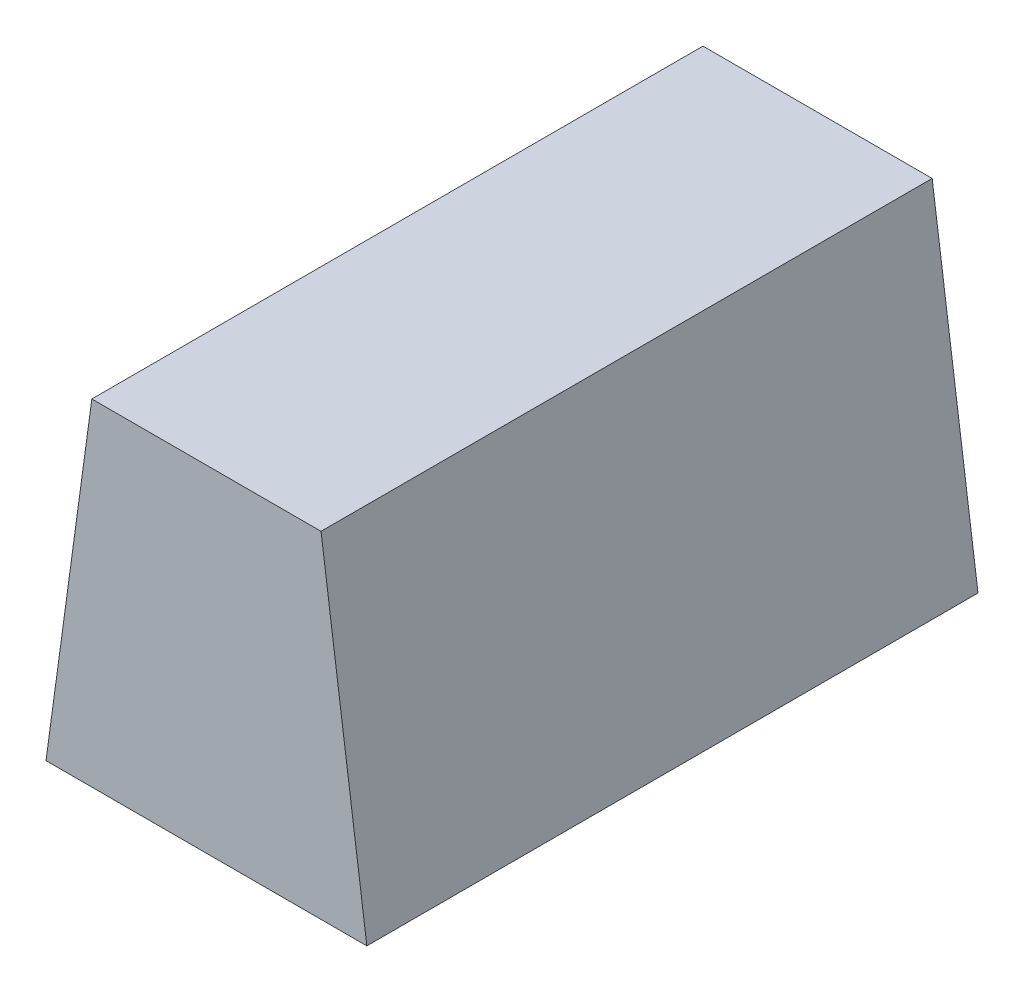
ISO-10303-21;
HEADER;
FILE_DESCRIPTION(('STEP AP214'),'2;1');
FILE_NAME('part.step','',(''),(''),'','','');
FILE_SCHEMA(('AUTOMOTIVE_DESIGN { 1 0 10303 214 1 1 1 1 }'));
ENDSEC;
DATA;
#1=APPLICATION_CONTEXT('core data for automotive mechanical design processes');
#2=APPLICATION_PROTOCOL_DEFINITION('international standard','automotive_design',2000,#1);
#3=PRODUCT_CONTEXT('',#1,'mechanical');
#4=PRODUCT('Part','Part','',(#3));
#5=PRODUCT_RELATED_PRODUCT_CATEGORY('part','',(#4));
#6=PRODUCT_DEFINITION_FORMATION('','',#4);
#7=PRODUCT_DEFINITION_CONTEXT('part definition',#1,'design');
#8=PRODUCT_DEFINITION('design','',#6,#7);
#9=PRODUCT_DEFINITION_SHAPE('','',#8);
#10=(LENGTH_UNIT() NAMED_UNIT(*) SI_UNIT(.MILLI.,.METRE.));
#11=(NAMED_UNIT(*) PLANE_ANGLE_UNIT() SI_UNIT($,.RADIAN.));
#12=(NAMED_UNIT(*) SI_UNIT($,.STERADIAN.) SOLID_ANGLE_UNIT());
#13=UNCERTAINTY_MEASURE_WITH_UNIT(LENGTH_MEASURE(1.E-05),#10,'distance_accuracy_value','');
#14=(GEOMETRIC_REPRESENTATION_CONTEXT(3) GLOBAL_UNCERTAINTY_ASSIGNED_CONTEXT((#13)) GLOBAL_UNIT_ASSIGNED_CONTEXT((#10,
#11,#12)) REPRESENTATION_CONTEXT('',''));
#15=CARTESIAN_POINT('',(0.,0.,0.));
#16=DIRECTION('',(0.,0.,1.));
#17=DIRECTION('',(1.,0.,0.));
#18=AXIS2_PLACEMENT_3D('',#15,#16,#17);
#19=CARTESIAN_POINT('',(3.,22.,40.));
#20=DIRECTION('',(0.990830168044299,-0.135113204733313,0.));
#21=DIRECTION('',(0.135113204733313,0.990830168044299,0.));
#22=AXIS2_PLACEMENT_3D('',#19,#20,#21);
#23=PLANE('',#22);
#24=DIRECTION('',(-0.135113204733313,-0.990830168044299,0.));
#25=VECTOR('',#24,1.);
#26=CARTESIAN_POINT('',(3.,22.,0.));
#27=LINE('',#26,#25);
#28=CARTESIAN_POINT('',(3.,22.,0.));
#29=VERTEX_POINT('',#28);
#30=CARTESIAN_POINT('',(0.,0.,0.));
#31=VERTEX_POINT('',#30);
#32=EDGE_CURVE('E96',#29,#31,#27,.T.);
#33=ORIENTED_EDGE('',*,*,#32,.T.);
#34=DIRECTION('',(0.,0.,-1.));
#35=VECTOR('',#34,1.);
#36=CARTESIAN_POINT('',(0.,0.,40.));
#37=LINE('',#36,#35);
#38=CARTESIAN_POINT('',(0.,0.,40.));
#39=VERTEX_POINT('',#38);
#40=EDGE_CURVE('E11',#39,#31,#37,.T.);
#41=ORIENTED_EDGE('',*,*,#40,.F.);
#42=DIRECTION('',(-0.135113204733313,-0.990830168044299,0.));
#43=VECTOR('',#42,1.);
#44=CARTESIAN_POINT('',(3.,22.,40.));
#45=LINE('',#44,#43);
#46=CARTESIAN_POINT('',(3.,22.,40.));
#47=VERTEX_POINT('',#46);
#48=EDGE_CURVE('E84',#47,#39,#45,.T.);
#49=ORIENTED_EDGE('',*,*,#48,.F.);
#50=DIRECTION('',(0.,0.,-1.));
#51=VECTOR('',#50,1.);
#52=CARTESIAN_POINT('',(3.,22.,40.));
#53=LINE('',#52,#51);
#54=EDGE_CURVE('E92',#47,#29,#53,.T.);
#55=ORIENTED_EDGE('',*,*,#54,.T.);
#56=EDGE_LOOP('',(#33,#41,#49,#55));
#57=FACE_BOUND('',#56,.T.);
#58=ADVANCED_FACE('F33',(#57),#23,.F.);
#59=CARTESIAN_POINT('',(0.,0.,40.));
#60=DIRECTION('',(0.,1.,0.));
#61=DIRECTION('',(0.,0.,1.));
#62=AXIS2_PLACEMENT_3D('',#59,#60,#61);
#63=PLANE('',#62);
#64=DIRECTION('',(1.,0.,0.));
#65=VECTOR('',#64,1.);
#66=CARTESIAN_POINT('',(0.,0.,0.));
#67=LINE('',#66,#65);
#68=CARTESIAN_POINT('',(21.,0.,0.));
#69=VERTEX_POINT('',#68);
#70=EDGE_CURVE('E88',#31,#69,#67,.T.);
#71=ORIENTED_EDGE('',*,*,#70,.T.);
#72=DIRECTION('',(0.,0.,-1.));
#73=VECTOR('',#72,1.);
#74=CARTESIAN_POINT('',(21.,0.,40.));
#75=LINE('',#74,#73);
#76=CARTESIAN_POINT('',(21.,0.,40.));
#77=VERTEX_POINT('',#76);
#78=EDGE_CURVE('E41',#77,#69,#75,.T.);
#79=ORIENTED_EDGE('',*,*,#78,.F.);
#80=DIRECTION('',(1.,0.,0.));
#81=VECTOR('',#80,1.);
#82=CARTESIAN_POINT('',(0.,0.,40.));
#83=LINE('',#82,#81);
#84=EDGE_CURVE('E79',#39,#77,#83,.T.);
#85=ORIENTED_EDGE('',*,*,#84,.F.);
#86=ORIENTED_EDGE('',*,*,#40,.T.);
#87=EDGE_LOOP('',(#71,#79,#85,#86));
#88=FACE_BOUND('',#87,.T.);
#89=ADVANCED_FACE('F87',(#88),#63,.F.);
#90=CARTESIAN_POINT('',(21.,0.,40.));
#91=DIRECTION('',(-0.990830168044299,-0.135113204733314,0.));
#92=DIRECTION('',(0.135113204733314,-0.990830168044299,0.));
#93=AXIS2_PLACEMENT_3D('',#90,#91,#92);
#94=PLANE('',#93);
#95=DIRECTION('',(-0.135113204733314,0.990830168044299,0.));
#96=VECTOR('',#95,1.);
#97=CARTESIAN_POINT('',(21.,0.,0.));
#98=LINE('',#97,#96);
#99=CARTESIAN_POINT('',(18.,22.,0.));
#100=VERTEX_POINT('',#99);
#101=EDGE_CURVE('E66',#69,#100,#98,.T.);
#102=ORIENTED_EDGE('',*,*,#101,.T.);
#103=DIRECTION('',(0.,0.,-1.));
#104=VECTOR('',#103,1.);
#105=CARTESIAN_POINT('',(18.,22.,40.));
#106=LINE('',#105,#104);
#107=CARTESIAN_POINT('',(18.,22.,40.));
#108=VERTEX_POINT('',#107);
#109=EDGE_CURVE('E89',#108,#100,#106,.T.);
#110=ORIENTED_EDGE('',*,*,#109,.F.);
#111=DIRECTION('',(-0.135113204733314,0.990830168044299,0.));
#112=VECTOR('',#111,1.);
#113=CARTESIAN_POINT('',(21.,0.,40.));
#114=LINE('',#113,#112);
#115=EDGE_CURVE('E82',#77,#108,#114,.T.);
#116=ORIENTED_EDGE('',*,*,#115,.F.);
#117=ORIENTED_EDGE('',*,*,#78,.T.);
#118=EDGE_LOOP('',(#102,#110,#116,#117));
#119=FACE_BOUND('',#118,.T.);
#120=ADVANCED_FACE('F90',(#119),#94,.F.);
#121=CARTESIAN_POINT('',(18.,22.,40.));
#122=DIRECTION('',(0.,-1.,0.));
#123=DIRECTION('',(1.,0.,0.));
#124=AXIS2_PLACEMENT_3D('',#121,#122,#123);
#125=PLANE('',#124);
#126=DIRECTION('',(-1.,0.,0.));
#127=VECTOR('',#126,1.);
#128=CARTESIAN_POINT('',(18.,22.,0.));
#129=LINE('',#128,#127);
#130=EDGE_CURVE('E72',#100,#29,#129,.T.);
#131=ORIENTED_EDGE('',*,*,#130,.T.);
#132=ORIENTED_EDGE('',*,*,#54,.F.);
#133=DIRECTION('',(-1.,0.,0.));
#134=VECTOR('',#133,1.);
#135=CARTESIAN_POINT('',(18.,22.,40.));
#136=LINE('',#135,#134);
#137=EDGE_CURVE('E49',#108,#47,#136,.T.);
#138=ORIENTED_EDGE('',*,*,#137,.F.);
#139=ORIENTED_EDGE('',*,*,#109,.T.);
#140=EDGE_LOOP('',(#131,#132,#138,#139));
#141=FACE_BOUND('',#140,.T.);
#142=ADVANCED_FACE('F103',(#141),#125,.F.);
#143=CARTESIAN_POINT('',(0.,0.,40.));
#144=DIRECTION('',(0.,0.,1.));
#145=DIRECTION('',(1.,0.,0.));
#146=AXIS2_PLACEMENT_3D('',#143,#144,#145);
#147=PLANE('',#146);
#148=ORIENTED_EDGE('',*,*,#48,.T.);
#149=ORIENTED_EDGE('',*,*,#84,.T.);
#150=ORIENTED_EDGE('',*,*,#115,.T.);
#151=ORIENTED_EDGE('',*,*,#137,.T.);
#152=EDGE_LOOP('',(#148,#149,#150,#151));
#153=FACE_BOUND('',#152,.T.);
#154=ADVANCED_FACE('F80',(#153),#147,.T.);
#155=CARTESIAN_POINT('',(0.,0.,0.));
#156=DIRECTION('',(0.,0.,1.));
#157=DIRECTION('',(1.,0.,0.));
#158=AXIS2_PLACEMENT_3D('',#155,#156,#157);
#159=PLANE('',#158);
#160=ORIENTED_EDGE('',*,*,#32,.F.);
#161=ORIENTED_EDGE('',*,*,#130,.F.);
#162=ORIENTED_EDGE('',*,*,#101,.F.);
#163=ORIENTED_EDGE('',*,*,#70,.F.);
#164=EDGE_LOOP('',(#160,#161,#162,#163));
#165=FACE_BOUND('',#164,.T.);
#166=ADVANCED_FACE('F106',(#165),#159,.F.);
#167=CLOSED_SHELL('',(#58,#89,#120,#142,#154,#166));
#168=MANIFOLD_SOLID_BREP('B2',#167);
#169=ADVANCED_BREP_SHAPE_REPRESENTATION('',(#18,#168),#14);
#170=SHAPE_DEFINITION_REPRESENTATION(#9,#169);
ENDSEC;
END-ISO-10303-21;
